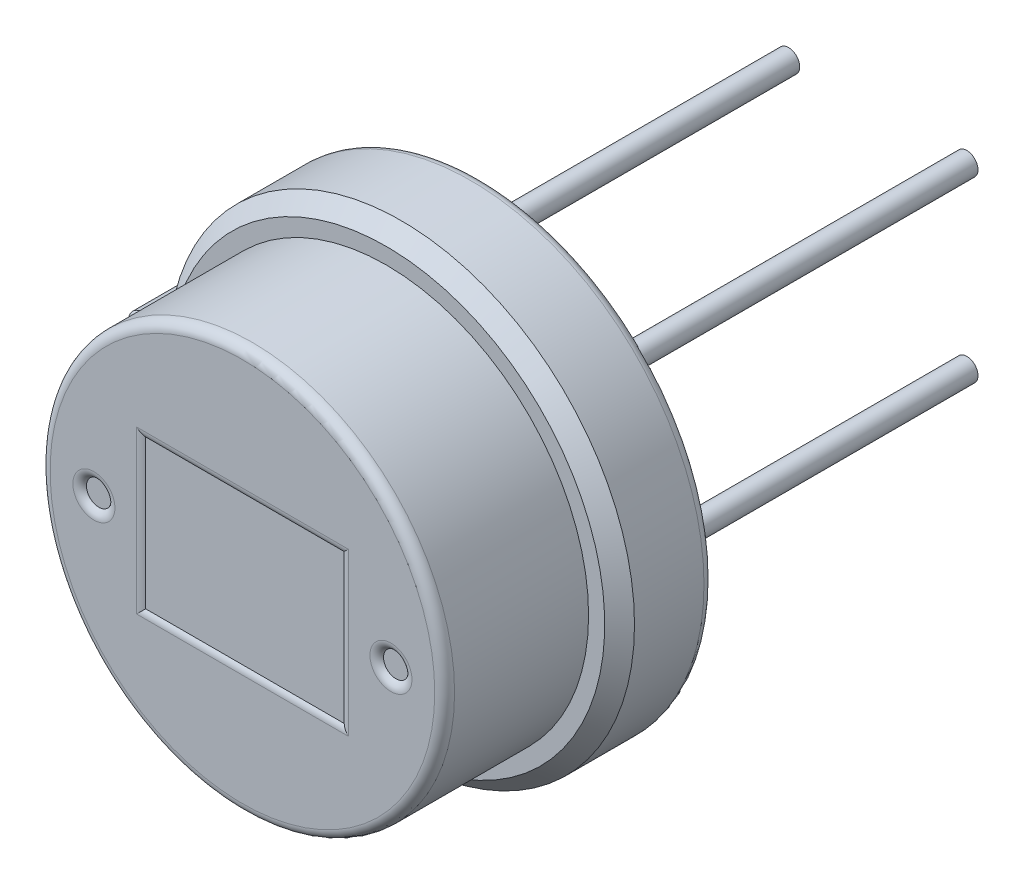
ISO-10303-21;
HEADER;
FILE_DESCRIPTION(('STEP AP214'),'2;1');
FILE_NAME('part.step','',(''),(''),'','','');
FILE_SCHEMA(('AUTOMOTIVE_DESIGN { 1 0 10303 214 1 1 1 1 }'));
ENDSEC;
DATA;
#1=APPLICATION_CONTEXT('core data for automotive mechanical design processes');
#2=APPLICATION_PROTOCOL_DEFINITION('international standard','automotive_design',2000,#1);
#3=PRODUCT_CONTEXT('',#1,'mechanical');
#4=PRODUCT('Part','Part','',(#3));
#5=PRODUCT_RELATED_PRODUCT_CATEGORY('part','',(#4));
#6=PRODUCT_DEFINITION_FORMATION('','',#4);
#7=PRODUCT_DEFINITION_CONTEXT('part definition',#1,'design');
#8=PRODUCT_DEFINITION('design','',#6,#7);
#9=PRODUCT_DEFINITION_SHAPE('','',#8);
#10=(LENGTH_UNIT() NAMED_UNIT(*) SI_UNIT(.MILLI.,.METRE.));
#11=(NAMED_UNIT(*) PLANE_ANGLE_UNIT() SI_UNIT($,.RADIAN.));
#12=(NAMED_UNIT(*) SI_UNIT($,.STERADIAN.) SOLID_ANGLE_UNIT());
#13=UNCERTAINTY_MEASURE_WITH_UNIT(LENGTH_MEASURE(1.E-05),#10,'distance_accuracy_value','');
#14=(GEOMETRIC_REPRESENTATION_CONTEXT(3) GLOBAL_UNCERTAINTY_ASSIGNED_CONTEXT((#13)) GLOBAL_UNIT_ASSIGNED_CONTEXT((#10,
#11,#12)) REPRESENTATION_CONTEXT('',''));
#15=CARTESIAN_POINT('',(0.,0.,0.));
#16=DIRECTION('',(0.,0.,1.));
#17=DIRECTION('',(1.,0.,0.));
#18=AXIS2_PLACEMENT_3D('',#15,#16,#17);
#19=CARTESIAN_POINT('',(-4.93558507170123,-0.800000000000001,1.9));
#20=DIRECTION('',(0.,0.,-1.));
#21=DIRECTION('',(-1.,0.,0.));
#22=AXIS2_PLACEMENT_3D('',#19,#20,#21);
#23=CYLINDRICAL_SURFACE('',#22,0.3);
#24=DIRECTION('',(0.,0.,-1.));
#25=VECTOR('',#24,1.);
#26=CARTESIAN_POINT('',(-4.93558507170123,-0.500000000000002,1.9));
#27=LINE('',#26,#25);
#28=CARTESIAN_POINT('',(-4.93558507170123,-0.500000000000002,1.60000000000001));
#29=VERTEX_POINT('',#28);
#30=CARTESIAN_POINT('',(-4.93558507170123,-0.500000000000002,0.200000000000001));
#31=VERTEX_POINT('',#30);
#32=EDGE_CURVE('E213',#29,#31,#27,.T.);
#33=ORIENTED_EDGE('',*,*,#32,.T.);
#34=CARTESIAN_POINT('',(-4.93558507170123,-0.800000000000001,0.2));
#35=DIRECTION('',(0.,0.,1.));
#36=DIRECTION('',(1.,0.,0.));
#37=AXIS2_PLACEMENT_3D('',#34,#35,#36);
#38=CIRCLE('',#37,0.3);
#39=CARTESIAN_POINT('',(-4.63944996739915,-0.752000000000001,0.200000000000001));
#40=VERTEX_POINT('',#39);
#41=EDGE_CURVE('E309',#31,#40,#38,.F.);
#42=ORIENTED_EDGE('',*,*,#41,.T.);
#43=DIRECTION('',(0.,0.,-1.));
#44=VECTOR('',#43,1.);
#45=CARTESIAN_POINT('',(-4.63944996739915,-0.752000000000001,1.9));
#46=LINE('',#45,#44);
#47=CARTESIAN_POINT('',(-4.63944996739915,-0.752000000000001,1.60000000000001));
#48=VERTEX_POINT('',#47);
#49=EDGE_CURVE('E219',#48,#40,#46,.T.);
#50=ORIENTED_EDGE('',*,*,#49,.F.);
#51=CARTESIAN_POINT('',(-4.93558507170123,-0.800000000000001,1.60000000000001));
#52=DIRECTION('',(0.,0.,1.));
#53=DIRECTION('',(1.,0.,0.));
#54=AXIS2_PLACEMENT_3D('',#51,#52,#53);
#55=CIRCLE('',#54,0.3);
#56=EDGE_CURVE('E300',#48,#29,#55,.T.);
#57=ORIENTED_EDGE('',*,*,#56,.T.);
#58=EDGE_LOOP('',(#33,#42,#50,#57));
#59=FACE_BOUND('',#58,.T.);
#60=ADVANCED_FACE('F44',(#59),#23,.F.);
#61=CARTESIAN_POINT('',(0.,0.,1.9));
#62=DIRECTION('',(0.,0.,-1.));
#63=DIRECTION('',(-1.,0.,0.));
#64=AXIS2_PLACEMENT_3D('',#61,#62,#63);
#65=CYLINDRICAL_SURFACE('',#64,4.7);
#66=ORIENTED_EDGE('',*,*,#49,.T.);
#67=CARTESIAN_POINT('',(0.,0.,0.2));
#68=DIRECTION('',(0.,0.,1.));
#69=DIRECTION('',(1.,0.,0.));
#70=AXIS2_PLACEMENT_3D('',#67,#68,#69);
#71=CIRCLE('',#70,4.7);
#72=CARTESIAN_POINT('',(-4.63944996739915,0.751999999999998,0.200000000000001));
#73=VERTEX_POINT('',#72);
#74=EDGE_CURVE('E11',#40,#73,#71,.T.);
#75=ORIENTED_EDGE('',*,*,#74,.T.);
#76=DIRECTION('',(0.,0.,-1.));
#77=VECTOR('',#76,1.);
#78=CARTESIAN_POINT('',(-4.63944996739915,0.751999999999998,1.9));
#79=LINE('',#78,#77);
#80=CARTESIAN_POINT('',(-4.63944996739915,0.751999999999998,1.60000000000001));
#81=VERTEX_POINT('',#80);
#82=EDGE_CURVE('E243',#81,#73,#79,.T.);
#83=ORIENTED_EDGE('',*,*,#82,.F.);
#84=CARTESIAN_POINT('',(0.,0.,1.60000000000001));
#85=DIRECTION('',(0.,0.,1.));
#86=DIRECTION('',(1.,0.,0.));
#87=AXIS2_PLACEMENT_3D('',#84,#85,#86);
#88=CIRCLE('',#87,4.7);
#89=EDGE_CURVE('E306',#81,#48,#88,.F.);
#90=ORIENTED_EDGE('',*,*,#89,.T.);
#91=EDGE_LOOP('',(#66,#75,#83,#90));
#92=FACE_BOUND('',#91,.T.);
#93=ADVANCED_FACE('F457',(#92),#65,.T.);
#94=CARTESIAN_POINT('',(-4.93558507170123,0.799999999999999,1.9));
#95=DIRECTION('',(0.,0.,-1.));
#96=DIRECTION('',(-1.,0.,0.));
#97=AXIS2_PLACEMENT_3D('',#94,#95,#96);
#98=CYLINDRICAL_SURFACE('',#97,0.3);
#99=ORIENTED_EDGE('',*,*,#82,.T.);
#100=CARTESIAN_POINT('',(-4.93558507170123,0.799999999999999,0.2));
#101=DIRECTION('',(0.,0.,1.));
#102=DIRECTION('',(1.,0.,0.));
#103=AXIS2_PLACEMENT_3D('',#100,#101,#102);
#104=CIRCLE('',#103,0.3);
#105=CARTESIAN_POINT('',(-4.93558507170123,0.499999999999999,0.200000000000001));
#106=VERTEX_POINT('',#105);
#107=EDGE_CURVE('E383',#73,#106,#104,.F.);
#108=ORIENTED_EDGE('',*,*,#107,.T.);
#109=DIRECTION('',(0.,0.,-1.));
#110=VECTOR('',#109,1.);
#111=CARTESIAN_POINT('',(-4.93558507170123,0.499999999999999,1.9));
#112=LINE('',#111,#110);
#113=CARTESIAN_POINT('',(-4.93558507170123,0.499999999999999,1.60000000000001));
#114=VERTEX_POINT('',#113);
#115=EDGE_CURVE('E239',#114,#106,#112,.T.);
#116=ORIENTED_EDGE('',*,*,#115,.F.);
#117=CARTESIAN_POINT('',(-4.93558507170123,0.799999999999999,1.60000000000001));
#118=DIRECTION('',(0.,0.,1.));
#119=DIRECTION('',(1.,0.,0.));
#120=AXIS2_PLACEMENT_3D('',#117,#118,#119);
#121=CIRCLE('',#120,0.3);
#122=EDGE_CURVE('E303',#114,#81,#121,.T.);
#123=ORIENTED_EDGE('',*,*,#122,.T.);
#124=EDGE_LOOP('',(#99,#108,#116,#123));
#125=FACE_BOUND('',#124,.T.);
#126=ADVANCED_FACE('F463',(#125),#98,.F.);
#127=CARTESIAN_POINT('',(-5.2,0.499999999999999,1.9));
#128=DIRECTION('',(0.,-1.,0.));
#129=DIRECTION('',(1.,0.,0.));
#130=AXIS2_PLACEMENT_3D('',#127,#128,#129);
#131=PLANE('',#130);
#132=ORIENTED_EDGE('',*,*,#115,.T.);
#133=DIRECTION('',(-1.,0.,0.));
#134=VECTOR('',#133,1.);
#135=CARTESIAN_POINT('',(-5.2,0.499999999999999,0.2));
#136=LINE('',#135,#134);
#137=CARTESIAN_POINT('',(-5.2,0.499999999999999,0.200000000000001));
#138=VERTEX_POINT('',#137);
#139=EDGE_CURVE('E380',#106,#138,#136,.T.);
#140=ORIENTED_EDGE('',*,*,#139,.T.);
#141=DIRECTION('',(0.,0.,-1.));
#142=VECTOR('',#141,1.);
#143=CARTESIAN_POINT('',(-5.2,0.499999999999999,1.9));
#144=LINE('',#143,#142);
#145=CARTESIAN_POINT('',(-5.2,0.499999999999999,1.60000000000001));
#146=VERTEX_POINT('',#145);
#147=EDGE_CURVE('E235',#146,#138,#144,.T.);
#148=ORIENTED_EDGE('',*,*,#147,.F.);
#149=DIRECTION('',(1.,0.,0.));
#150=VECTOR('',#149,1.);
#151=CARTESIAN_POINT('',(-4.93558507170123,0.499999999999999,1.60000000000001));
#152=LINE('',#151,#150);
#153=EDGE_CURVE('E297',#146,#114,#152,.T.);
#154=ORIENTED_EDGE('',*,*,#153,.T.);
#155=EDGE_LOOP('',(#132,#140,#148,#154));
#156=FACE_BOUND('',#155,.T.);
#157=ADVANCED_FACE('F644',(#156),#131,.F.);
#158=CARTESIAN_POINT('',(-5.2,0.199999999999999,1.9));
#159=DIRECTION('',(0.,0.,-1.));
#160=DIRECTION('',(-1.,0.,0.));
#161=AXIS2_PLACEMENT_3D('',#158,#159,#160);
#162=CYLINDRICAL_SURFACE('',#161,0.3);
#163=ORIENTED_EDGE('',*,*,#147,.T.);
#164=CARTESIAN_POINT('',(-5.2,0.199999999999999,0.199999999999999));
#165=DIRECTION('',(0.,0.,1.));
#166=DIRECTION('',(1.,0.,0.));
#167=AXIS2_PLACEMENT_3D('',#164,#165,#166);
#168=CIRCLE('',#167,0.3);
#169=CARTESIAN_POINT('',(-5.5,0.199999999999997,0.2));
#170=VERTEX_POINT('',#169);
#171=EDGE_CURVE('E377',#138,#170,#168,.T.);
#172=ORIENTED_EDGE('',*,*,#171,.T.);
#173=DIRECTION('',(0.,0.,-1.));
#174=VECTOR('',#173,1.);
#175=CARTESIAN_POINT('',(-5.5,0.199999999999997,1.9));
#176=LINE('',#175,#174);
#177=CARTESIAN_POINT('',(-5.5,0.199999999999997,1.60000000000001));
#178=VERTEX_POINT('',#177);
#179=EDGE_CURVE('E231',#178,#170,#176,.T.);
#180=ORIENTED_EDGE('',*,*,#179,.F.);
#181=CARTESIAN_POINT('',(-5.2,0.199999999999999,1.60000000000001));
#182=DIRECTION('',(0.,0.,1.));
#183=DIRECTION('',(1.,0.,0.));
#184=AXIS2_PLACEMENT_3D('',#181,#182,#183);
#185=CIRCLE('',#184,0.3);
#186=EDGE_CURVE('E291',#178,#146,#185,.F.);
#187=ORIENTED_EDGE('',*,*,#186,.T.);
#188=EDGE_LOOP('',(#163,#172,#180,#187));
#189=FACE_BOUND('',#188,.T.);
#190=ADVANCED_FACE('F640',(#189),#162,.T.);
#191=CARTESIAN_POINT('',(-5.5,0.199999999999997,1.9));
#192=DIRECTION('',(1.,0.,0.));
#193=DIRECTION('',(0.,0.,-1.));
#194=AXIS2_PLACEMENT_3D('',#191,#192,#193);
#195=PLANE('',#194);
#196=ORIENTED_EDGE('',*,*,#179,.T.);
#197=DIRECTION('',(0.,-1.,0.));
#198=VECTOR('',#197,1.);
#199=CARTESIAN_POINT('',(-5.5,0.199999999999997,0.2));
#200=LINE('',#199,#198);
#201=CARTESIAN_POINT('',(-5.5,-0.199999999999999,0.200000000000001));
#202=VERTEX_POINT('',#201);
#203=EDGE_CURVE('E374',#170,#202,#200,.T.);
#204=ORIENTED_EDGE('',*,*,#203,.T.);
#205=DIRECTION('',(0.,0.,-1.));
#206=VECTOR('',#205,1.);
#207=CARTESIAN_POINT('',(-5.5,-0.199999999999999,1.9));
#208=LINE('',#207,#206);
#209=CARTESIAN_POINT('',(-5.5,-0.199999999999999,1.60000000000001));
#210=VERTEX_POINT('',#209);
#211=EDGE_CURVE('E227',#210,#202,#208,.T.);
#212=ORIENTED_EDGE('',*,*,#211,.F.);
#213=DIRECTION('',(0.,1.,0.));
#214=VECTOR('',#213,1.);
#215=CARTESIAN_POINT('',(-5.5,0.199999999999997,1.60000000000001));
#216=LINE('',#215,#214);
#217=EDGE_CURVE('E284',#210,#178,#216,.T.);
#218=ORIENTED_EDGE('',*,*,#217,.T.);
#219=EDGE_LOOP('',(#196,#204,#212,#218));
#220=FACE_BOUND('',#219,.T.);
#221=ADVANCED_FACE('F636',(#220),#195,.F.);
#222=CARTESIAN_POINT('',(-5.2,-0.200000000000002,1.9));
#223=DIRECTION('',(0.,0.,-1.));
#224=DIRECTION('',(-1.,0.,0.));
#225=AXIS2_PLACEMENT_3D('',#222,#223,#224);
#226=CYLINDRICAL_SURFACE('',#225,0.3);
#227=ORIENTED_EDGE('',*,*,#211,.T.);
#228=CARTESIAN_POINT('',(-5.2,-0.200000000000002,0.199999999999999));
#229=DIRECTION('',(0.,0.,1.));
#230=DIRECTION('',(1.,0.,0.));
#231=AXIS2_PLACEMENT_3D('',#228,#229,#230);
#232=CIRCLE('',#231,0.3);
#233=CARTESIAN_POINT('',(-5.2,-0.500000000000001,0.2));
#234=VERTEX_POINT('',#233);
#235=EDGE_CURVE('E371',#202,#234,#232,.T.);
#236=ORIENTED_EDGE('',*,*,#235,.T.);
#237=DIRECTION('',(0.,0.,-1.));
#238=VECTOR('',#237,1.);
#239=CARTESIAN_POINT('',(-5.2,-0.500000000000001,1.9));
#240=LINE('',#239,#238);
#241=CARTESIAN_POINT('',(-5.2,-0.500000000000001,1.60000000000001));
#242=VERTEX_POINT('',#241);
#243=EDGE_CURVE('E223',#242,#234,#240,.T.);
#244=ORIENTED_EDGE('',*,*,#243,.F.);
#245=CARTESIAN_POINT('',(-5.2,-0.200000000000002,1.60000000000001));
#246=DIRECTION('',(0.,0.,1.));
#247=DIRECTION('',(1.,0.,0.));
#248=AXIS2_PLACEMENT_3D('',#245,#246,#247);
#249=CIRCLE('',#248,0.3);
#250=EDGE_CURVE('E288',#242,#210,#249,.F.);
#251=ORIENTED_EDGE('',*,*,#250,.T.);
#252=EDGE_LOOP('',(#227,#236,#244,#251));
#253=FACE_BOUND('',#252,.T.);
#254=ADVANCED_FACE('F632',(#253),#226,.T.);
#255=CARTESIAN_POINT('',(-5.2,-0.500000000000001,1.9));
#256=DIRECTION('',(0.,1.,0.));
#257=DIRECTION('',(-1.,0.,0.));
#258=AXIS2_PLACEMENT_3D('',#255,#256,#257);
#259=PLANE('',#258);
#260=ORIENTED_EDGE('',*,*,#243,.T.);
#261=DIRECTION('',(1.,0.,0.));
#262=VECTOR('',#261,1.);
#263=CARTESIAN_POINT('',(-5.2,-0.500000000000001,0.2));
#264=LINE('',#263,#262);
#265=EDGE_CURVE('E368',#234,#31,#264,.T.);
#266=ORIENTED_EDGE('',*,*,#265,.T.);
#267=ORIENTED_EDGE('',*,*,#32,.F.);
#268=DIRECTION('',(-1.,0.,0.));
#269=VECTOR('',#268,1.);
#270=CARTESIAN_POINT('',(-5.2,-0.500000000000001,1.60000000000001));
#271=LINE('',#270,#269);
#272=EDGE_CURVE('E294',#29,#242,#271,.T.);
#273=ORIENTED_EDGE('',*,*,#272,.T.);
#274=EDGE_LOOP('',(#260,#266,#267,#273));
#275=FACE_BOUND('',#274,.T.);
#276=ADVANCED_FACE('F627',(#275),#259,.F.);
#277=CARTESIAN_POINT('',(-4.93558507170123,-0.800000000000001,1.9));
#278=DIRECTION('',(0.,0.,1.));
#279=DIRECTION('',(1.,0.,0.));
#280=AXIS2_PLACEMENT_3D('',#277,#278,#279);
#281=PLANE('',#280);
#282=DIRECTION('',(-1.,0.,0.));
#283=VECTOR('',#282,1.);
#284=CARTESIAN_POINT('',(-5.2,0.200000000000007,1.9));
#285=LINE('',#284,#283);
#286=CARTESIAN_POINT('',(-4.93558507170123,0.200000000000007,1.9));
#287=VERTEX_POINT('',#286);
#288=CARTESIAN_POINT('',(-5.2,0.200000000000007,1.9));
#289=VERTEX_POINT('',#288);
#290=EDGE_CURVE('E274',#287,#289,#285,.T.);
#291=ORIENTED_EDGE('',*,*,#290,.T.);
#292=DIRECTION('',(0.,-1.,0.));
#293=VECTOR('',#292,1.);
#294=CARTESIAN_POINT('',(-5.20000000000001,-0.199999999999999,1.9));
#295=LINE('',#294,#293);
#296=CARTESIAN_POINT('',(-5.2,-0.200000000000009,1.9));
#297=VERTEX_POINT('',#296);
#298=EDGE_CURVE('E280',#289,#297,#295,.T.);
#299=ORIENTED_EDGE('',*,*,#298,.T.);
#300=DIRECTION('',(1.,0.,0.));
#301=VECTOR('',#300,1.);
#302=CARTESIAN_POINT('',(-4.93558507170123,-0.20000000000001,1.9));
#303=LINE('',#302,#301);
#304=CARTESIAN_POINT('',(-4.93558507170123,-0.20000000000001,1.9));
#305=VERTEX_POINT('',#304);
#306=EDGE_CURVE('E277',#297,#305,#303,.T.);
#307=ORIENTED_EDGE('',*,*,#306,.T.);
#308=CARTESIAN_POINT('',(-4.93558507170123,-0.800000000000001,1.9));
#309=DIRECTION('',(0.,0.,1.));
#310=DIRECTION('',(1.,0.,0.));
#311=AXIS2_PLACEMENT_3D('',#308,#309,#310);
#312=CIRCLE('',#311,0.599999999999992);
#313=CARTESIAN_POINT('',(-4.34331486309709,-0.704000000000002,1.9));
#314=VERTEX_POINT('',#313);
#315=EDGE_CURVE('E271',#305,#314,#312,.F.);
#316=ORIENTED_EDGE('',*,*,#315,.T.);
#317=CARTESIAN_POINT('',(0.,0.,1.9));
#318=DIRECTION('',(0.,0.,1.));
#319=DIRECTION('',(1.,0.,0.));
#320=AXIS2_PLACEMENT_3D('',#317,#318,#319);
#321=CIRCLE('',#320,4.40000000000001);
#322=CARTESIAN_POINT('',(-4.34331486309709,0.703999999999999,1.9));
#323=VERTEX_POINT('',#322);
#324=EDGE_CURVE('E265',#314,#323,#321,.T.);
#325=ORIENTED_EDGE('',*,*,#324,.T.);
#326=CARTESIAN_POINT('',(-4.93558507170123,0.799999999999999,1.9));
#327=DIRECTION('',(0.,0.,1.));
#328=DIRECTION('',(1.,0.,0.));
#329=AXIS2_PLACEMENT_3D('',#326,#327,#328);
#330=CIRCLE('',#329,0.599999999999992);
#331=EDGE_CURVE('E268',#323,#287,#330,.F.);
#332=ORIENTED_EDGE('',*,*,#331,.T.);
#333=EDGE_LOOP('',(#291,#299,#307,#316,#325,#332));
#334=FACE_BOUND('',#333,.T.);
#335=CARTESIAN_POINT('',(0.,0.,1.9));
#336=DIRECTION('',(0.,0.,1.));
#337=DIRECTION('',(1.,0.,0.));
#338=AXIS2_PLACEMENT_3D('',#335,#336,#337);
#339=CIRCLE('',#338,4.075);
#340=CARTESIAN_POINT('',(4.075,0.,1.9));
#341=VERTEX_POINT('',#340);
#342=EDGE_CURVE('E214',#341,#341,#339,.T.);
#343=ORIENTED_EDGE('',*,*,#342,.F.);
#344=EDGE_LOOP('',(#343));
#345=FACE_BOUND('',#344,.T.);
#346=ADVANCED_FACE('F591',(#334,#345),#281,.T.);
#347=CARTESIAN_POINT('',(-4.93558507170123,-0.800000000000001,0.));
#348=DIRECTION('',(0.,0.,1.));
#349=DIRECTION('',(1.,0.,0.));
#350=AXIS2_PLACEMENT_3D('',#347,#348,#349);
#351=PLANE('',#350);
#352=CARTESIAN_POINT('',(0.,0.,0.));
#353=DIRECTION('',(0.,0.,1.));
#354=DIRECTION('',(1.,0.,0.));
#355=AXIS2_PLACEMENT_3D('',#352,#353,#354);
#356=CIRCLE('',#355,4.5);
#357=CARTESIAN_POINT('',(-4.4420265645311,0.719999999999998,0.));
#358=VERTEX_POINT('',#357);
#359=CARTESIAN_POINT('',(-4.4420265645311,-0.720000000000001,0.));
#360=VERTEX_POINT('',#359);
#361=EDGE_CURVE('E344',#358,#360,#356,.F.);
#362=ORIENTED_EDGE('',*,*,#361,.T.);
#363=CARTESIAN_POINT('',(-4.93558507170123,-0.800000000000001,0.));
#364=DIRECTION('',(0.,0.,1.));
#365=DIRECTION('',(1.,0.,0.));
#366=AXIS2_PLACEMENT_3D('',#363,#364,#365);
#367=CIRCLE('',#366,0.5);
#368=CARTESIAN_POINT('',(-4.93558507170123,-0.300000000000002,0.));
#369=VERTEX_POINT('',#368);
#370=EDGE_CURVE('E364',#360,#369,#367,.T.);
#371=ORIENTED_EDGE('',*,*,#370,.T.);
#372=DIRECTION('',(1.,0.,0.));
#373=VECTOR('',#372,1.);
#374=CARTESIAN_POINT('',(-4.93558507170123,-0.300000000000002,0.));
#375=LINE('',#374,#373);
#376=CARTESIAN_POINT('',(-5.2,-0.300000000000001,0.));
#377=VERTEX_POINT('',#376);
#378=EDGE_CURVE('E361',#369,#377,#375,.F.);
#379=ORIENTED_EDGE('',*,*,#378,.T.);
#380=CARTESIAN_POINT('',(-5.2,-0.200000000000002,0.));
#381=DIRECTION('',(0.,0.,1.));
#382=DIRECTION('',(1.,0.,0.));
#383=AXIS2_PLACEMENT_3D('',#380,#381,#382);
#384=CIRCLE('',#383,0.0999999999999999);
#385=CARTESIAN_POINT('',(-5.3,-0.200000000000001,0.));
#386=VERTEX_POINT('',#385);
#387=EDGE_CURVE('E359',#377,#386,#384,.F.);
#388=ORIENTED_EDGE('',*,*,#387,.T.);
#389=DIRECTION('',(0.,-1.,0.));
#390=VECTOR('',#389,1.);
#391=CARTESIAN_POINT('',(-5.3,-0.800000000000001,0.));
#392=LINE('',#391,#390);
#393=CARTESIAN_POINT('',(-5.3,0.199999999999997,0.));
#394=VERTEX_POINT('',#393);
#395=EDGE_CURVE('E356',#386,#394,#392,.F.);
#396=ORIENTED_EDGE('',*,*,#395,.T.);
#397=CARTESIAN_POINT('',(-5.2,0.199999999999999,0.));
#398=DIRECTION('',(0.,0.,1.));
#399=DIRECTION('',(1.,0.,0.));
#400=AXIS2_PLACEMENT_3D('',#397,#398,#399);
#401=CIRCLE('',#400,0.0999999999999999);
#402=CARTESIAN_POINT('',(-5.2,0.299999999999999,0.));
#403=VERTEX_POINT('',#402);
#404=EDGE_CURVE('E353',#394,#403,#401,.F.);
#405=ORIENTED_EDGE('',*,*,#404,.T.);
#406=DIRECTION('',(-1.,0.,0.));
#407=VECTOR('',#406,1.);
#408=CARTESIAN_POINT('',(-4.93558507170123,0.299999999999999,0.));
#409=LINE('',#408,#407);
#410=CARTESIAN_POINT('',(-4.93558507170123,0.299999999999999,0.));
#411=VERTEX_POINT('',#410);
#412=EDGE_CURVE('E350',#403,#411,#409,.F.);
#413=ORIENTED_EDGE('',*,*,#412,.T.);
#414=CARTESIAN_POINT('',(-4.93558507170123,0.799999999999999,0.));
#415=DIRECTION('',(0.,0.,1.));
#416=DIRECTION('',(1.,0.,0.));
#417=AXIS2_PLACEMENT_3D('',#414,#415,#416);
#418=CIRCLE('',#417,0.5);
#419=EDGE_CURVE('E347',#411,#358,#418,.T.);
#420=ORIENTED_EDGE('',*,*,#419,.T.);
#421=EDGE_LOOP('',(#362,#371,#379,#388,#396,#405,#413,#420));
#422=FACE_BOUND('',#421,.T.);
#423=CARTESIAN_POINT('',(-1.7960512242138,1.79605122421386,0.));
#424=DIRECTION('',(0.,0.,1.));
#425=DIRECTION('',(1.,0.,0.));
#426=AXIS2_PLACEMENT_3D('',#423,#424,#425);
#427=CIRCLE('',#426,0.225);
#428=CARTESIAN_POINT('',(-1.5710512242138,1.79605122421386,0.));
#429=VERTEX_POINT('',#428);
#430=EDGE_CURVE('E261',#429,#429,#427,.F.);
#431=ORIENTED_EDGE('',*,*,#430,.F.);
#432=EDGE_LOOP('',(#431));
#433=FACE_BOUND('',#432,.T.);
#434=CARTESIAN_POINT('',(1.79605122421384,1.79605122421382,0.));
#435=DIRECTION('',(0.,0.,1.));
#436=DIRECTION('',(1.,0.,0.));
#437=AXIS2_PLACEMENT_3D('',#434,#435,#436);
#438=CIRCLE('',#437,0.225000000000001);
#439=CARTESIAN_POINT('',(2.02105122421384,1.79605122421382,0.));
#440=VERTEX_POINT('',#439);
#441=EDGE_CURVE('E257',#440,#440,#438,.F.);
#442=ORIENTED_EDGE('',*,*,#441,.F.);
#443=EDGE_LOOP('',(#442));
#444=FACE_BOUND('',#443,.T.);
#445=CARTESIAN_POINT('',(-1.79605122421384,-1.79605122421382,0.));
#446=DIRECTION('',(0.,0.,1.));
#447=DIRECTION('',(1.,0.,0.));
#448=AXIS2_PLACEMENT_3D('',#445,#446,#447);
#449=CIRCLE('',#448,0.225);
#450=CARTESIAN_POINT('',(-1.57105122421384,-1.79605122421382,0.));
#451=VERTEX_POINT('',#450);
#452=EDGE_CURVE('E253',#451,#451,#449,.F.);
#453=ORIENTED_EDGE('',*,*,#452,.F.);
#454=EDGE_LOOP('',(#453));
#455=FACE_BOUND('',#454,.T.);
#456=CARTESIAN_POINT('',(1.79605122421384,-1.79605122421382,0.));
#457=DIRECTION('',(0.,0.,1.));
#458=DIRECTION('',(1.,0.,0.));
#459=AXIS2_PLACEMENT_3D('',#456,#457,#458);
#460=CIRCLE('',#459,0.225);
#461=CARTESIAN_POINT('',(2.02105122421384,-1.79605122421382,0.));
#462=VERTEX_POINT('',#461);
#463=EDGE_CURVE('E218',#462,#462,#460,.F.);
#464=ORIENTED_EDGE('',*,*,#463,.F.);
#465=EDGE_LOOP('',(#464));
#466=FACE_BOUND('',#465,.T.);
#467=ADVANCED_FACE('F588',(#422,#433,#444,#455,#466),#351,.F.);
#468=CARTESIAN_POINT('',(0.,0.,4.8));
#469=DIRECTION('',(0.,0.,-1.));
#470=DIRECTION('',(-1.,0.,0.));
#471=AXIS2_PLACEMENT_3D('',#468,#469,#470);
#472=CYLINDRICAL_SURFACE('',#471,4.075);
#473=CARTESIAN_POINT('',(0.,0.,4.6));
#474=DIRECTION('',(0.,0.,1.));
#475=DIRECTION('',(1.,0.,0.));
#476=AXIS2_PLACEMENT_3D('',#473,#474,#475);
#477=CIRCLE('',#476,4.075);
#478=CARTESIAN_POINT('',(4.075,0.,4.6));
#479=VERTEX_POINT('',#478);
#480=EDGE_CURVE('E54',#479,#479,#477,.F.);
#481=ORIENTED_EDGE('',*,*,#480,.T.);
#482=EDGE_LOOP('',(#481));
#483=FACE_BOUND('',#482,.T.);
#484=ORIENTED_EDGE('',*,*,#342,.T.);
#485=EDGE_LOOP('',(#484));
#486=FACE_BOUND('',#485,.T.);
#487=ADVANCED_FACE('F546',(#483,#486),#472,.T.);
#488=CARTESIAN_POINT('',(0.,0.,4.8));
#489=DIRECTION('',(0.,0.,1.));
#490=DIRECTION('',(1.,0.,0.));
#491=AXIS2_PLACEMENT_3D('',#488,#489,#490);
#492=PLANE('',#491);
#493=CARTESIAN_POINT('',(0.,0.,4.8));
#494=DIRECTION('',(0.,0.,1.));
#495=DIRECTION('',(1.,0.,0.));
#496=AXIS2_PLACEMENT_3D('',#493,#494,#495);
#497=CIRCLE('',#496,3.875);
#498=CARTESIAN_POINT('',(3.875,0.,4.8));
#499=VERTEX_POINT('',#498);
#500=EDGE_CURVE('E403',#499,#499,#497,.T.);
#501=ORIENTED_EDGE('',*,*,#500,.T.);
#502=EDGE_LOOP('',(#501));
#503=FACE_BOUND('',#502,.T.);
#504=DIRECTION('',(0.,-1.,0.));
#505=VECTOR('',#504,1.);
#506=CARTESIAN_POINT('',(-2.13228756555323,1.5,4.8));
#507=LINE('',#506,#505);
#508=CARTESIAN_POINT('',(-2.13228756555323,-1.63228756555323,4.8));
#509=VERTEX_POINT('',#508);
#510=CARTESIAN_POINT('',(-2.13228756555323,1.63228756555323,4.8));
#511=VERTEX_POINT('',#510);
#512=EDGE_CURVE('E62',#509,#511,#507,.F.);
#513=ORIENTED_EDGE('',*,*,#512,.T.);
#514=DIRECTION('',(-1.,0.,0.));
#515=VECTOR('',#514,1.);
#516=CARTESIAN_POINT('',(2.,1.63228756555323,4.8));
#517=LINE('',#516,#515);
#518=CARTESIAN_POINT('',(2.13228756555323,1.63228756555323,4.8));
#519=VERTEX_POINT('',#518);
#520=EDGE_CURVE('E400',#511,#519,#517,.F.);
#521=ORIENTED_EDGE('',*,*,#520,.T.);
#522=DIRECTION('',(0.,1.,0.));
#523=VECTOR('',#522,1.);
#524=CARTESIAN_POINT('',(2.13228756555323,-1.5,4.8));
#525=LINE('',#524,#523);
#526=CARTESIAN_POINT('',(2.13228756555323,-1.63228756555323,4.8));
#527=VERTEX_POINT('',#526);
#528=EDGE_CURVE('E193',#519,#527,#525,.F.);
#529=ORIENTED_EDGE('',*,*,#528,.T.);
#530=DIRECTION('',(1.,0.,0.));
#531=VECTOR('',#530,1.);
#532=CARTESIAN_POINT('',(-2.,-1.63228756555323,4.8));
#533=LINE('',#532,#531);
#534=EDGE_CURVE('E67',#527,#509,#533,.F.);
#535=ORIENTED_EDGE('',*,*,#534,.T.);
#536=EDGE_LOOP('',(#513,#521,#529,#535));
#537=FACE_BOUND('',#536,.T.);
#538=CARTESIAN_POINT('',(2.99263538753936,0.,4.8));
#539=DIRECTION('',(0.,0.,1.));
#540=DIRECTION('',(1.,0.,0.));
#541=AXIS2_PLACEMENT_3D('',#538,#539,#540);
#542=CIRCLE('',#541,0.423205080756889);
#543=CARTESIAN_POINT('',(3.41584046829624,0.,4.8));
#544=VERTEX_POINT('',#543);
#545=EDGE_CURVE('E390',#544,#544,#542,.F.);
#546=ORIENTED_EDGE('',*,*,#545,.T.);
#547=EDGE_LOOP('',(#546));
#548=FACE_BOUND('',#547,.T.);
#549=CARTESIAN_POINT('',(-2.99263538753936,0.,4.8));
#550=DIRECTION('',(0.,0.,1.));
#551=DIRECTION('',(1.,0.,0.));
#552=AXIS2_PLACEMENT_3D('',#549,#550,#551);
#553=CIRCLE('',#552,0.423205080756889);
#554=CARTESIAN_POINT('',(-2.56943030678247,0.,4.8));
#555=VERTEX_POINT('',#554);
#556=EDGE_CURVE('E386',#555,#555,#553,.F.);
#557=ORIENTED_EDGE('',*,*,#556,.T.);
#558=EDGE_LOOP('',(#557));
#559=FACE_BOUND('',#558,.T.);
#560=ADVANCED_FACE('F544',(#503,#537,#548,#559),#492,.T.);
#561=CARTESIAN_POINT('',(0.,0.,4.75));
#562=DIRECTION('',(0.,0.,1.));
#563=DIRECTION('',(1.,0.,0.));
#564=AXIS2_PLACEMENT_3D('',#561,#562,#563);
#565=PLANE('',#564);
#566=DIRECTION('',(0.,1.,0.));
#567=VECTOR('',#566,1.);
#568=CARTESIAN_POINT('',(2.,1.5,4.75));
#569=LINE('',#568,#567);
#570=CARTESIAN_POINT('',(2.,-1.5,4.75));
#571=VERTEX_POINT('',#570);
#572=CARTESIAN_POINT('',(2.,1.5,4.75));
#573=VERTEX_POINT('',#572);
#574=EDGE_CURVE('E177',#571,#573,#569,.T.);
#575=ORIENTED_EDGE('',*,*,#574,.T.);
#576=DIRECTION('',(-1.,0.,0.));
#577=VECTOR('',#576,1.);
#578=CARTESIAN_POINT('',(-2.,1.5,4.75));
#579=LINE('',#578,#577);
#580=CARTESIAN_POINT('',(-2.,1.5,4.75));
#581=VERTEX_POINT('',#580);
#582=EDGE_CURVE('E181',#573,#581,#579,.T.);
#583=ORIENTED_EDGE('',*,*,#582,.T.);
#584=DIRECTION('',(0.,-1.,0.));
#585=VECTOR('',#584,1.);
#586=CARTESIAN_POINT('',(-2.,1.5,4.75));
#587=LINE('',#586,#585);
#588=CARTESIAN_POINT('',(-2.,-1.5,4.75));
#589=VERTEX_POINT('',#588);
#590=EDGE_CURVE('E203',#581,#589,#587,.T.);
#591=ORIENTED_EDGE('',*,*,#590,.T.);
#592=DIRECTION('',(1.,0.,0.));
#593=VECTOR('',#592,1.);
#594=CARTESIAN_POINT('',(-2.,-1.5,4.75));
#595=LINE('',#594,#593);
#596=EDGE_CURVE('E183',#589,#571,#595,.T.);
#597=ORIENTED_EDGE('',*,*,#596,.T.);
#598=EDGE_LOOP('',(#575,#583,#591,#597));
#599=FACE_BOUND('',#598,.T.);
#600=ADVANCED_FACE('F179',(#599),#565,.T.);
#601=CARTESIAN_POINT('',(2.99263538753936,0.,4.7));
#602=DIRECTION('',(0.,0.,-1.));
#603=DIRECTION('',(-1.,0.,0.));
#604=AXIS2_PLACEMENT_3D('',#601,#602,#603);
#605=PLANE('',#604);
#606=CARTESIAN_POINT('',(2.99263538753936,0.,4.7));
#607=DIRECTION('',(0.,0.,1.));
#608=DIRECTION('',(-1.,0.,0.));
#609=AXIS2_PLACEMENT_3D('',#606,#607,#608);
#610=CIRCLE('',#609,0.25);
#611=CARTESIAN_POINT('',(2.74263538753936,0.,4.7));
#612=VERTEX_POINT('',#611);
#613=EDGE_CURVE('E559',#612,#612,#610,.T.);
#614=ORIENTED_EDGE('',*,*,#613,.T.);
#615=EDGE_LOOP('',(#614));
#616=FACE_BOUND('',#615,.T.);
#617=ADVANCED_FACE('F613',(#616),#605,.F.);
#618=CARTESIAN_POINT('',(-2.99263538753936,0.,4.7));
#619=DIRECTION('',(0.,0.,1.));
#620=DIRECTION('',(1.,0.,0.));
#621=AXIS2_PLACEMENT_3D('',#618,#619,#620);
#622=PLANE('',#621);
#623=CARTESIAN_POINT('',(-2.99263538753936,0.,4.7));
#624=DIRECTION('',(0.,0.,1.));
#625=DIRECTION('',(1.,0.,0.));
#626=AXIS2_PLACEMENT_3D('',#623,#624,#625);
#627=CIRCLE('',#626,0.25);
#628=CARTESIAN_POINT('',(-2.74263538753936,0.,4.7));
#629=VERTEX_POINT('',#628);
#630=EDGE_CURVE('E188',#629,#629,#627,.T.);
#631=ORIENTED_EDGE('',*,*,#630,.T.);
#632=EDGE_LOOP('',(#631));
#633=FACE_BOUND('',#632,.T.);
#634=ADVANCED_FACE('F603',(#633),#622,.T.);
#635=CARTESIAN_POINT('',(1.79605122421384,-1.79605122421382,-8.));
#636=DIRECTION('',(0.,0.,1.));
#637=DIRECTION('',(1.,0.,0.));
#638=AXIS2_PLACEMENT_3D('',#635,#636,#637);
#639=CYLINDRICAL_SURFACE('',#638,0.225);
#640=CARTESIAN_POINT('',(1.79605122421384,-1.79605122421382,-8.));
#641=DIRECTION('',(0.,0.,-1.));
#642=DIRECTION('',(-1.,0.,0.));
#643=AXIS2_PLACEMENT_3D('',#640,#641,#642);
#644=CIRCLE('',#643,0.225);
#645=CARTESIAN_POINT('',(1.57105122421384,-1.79605122421382,-8.));
#646=VERTEX_POINT('',#645);
#647=EDGE_CURVE('E563',#646,#646,#644,.T.);
#648=ORIENTED_EDGE('',*,*,#647,.F.);
#649=EDGE_LOOP('',(#648));
#650=FACE_BOUND('',#649,.T.);
#651=ORIENTED_EDGE('',*,*,#463,.T.);
#652=EDGE_LOOP('',(#651));
#653=FACE_BOUND('',#652,.T.);
#654=ADVANCED_FACE('F600',(#650,#653),#639,.T.);
#655=CARTESIAN_POINT('',(1.79605122421384,-1.79605122421382,-8.));
#656=DIRECTION('',(0.,0.,-1.));
#657=DIRECTION('',(-1.,0.,0.));
#658=AXIS2_PLACEMENT_3D('',#655,#656,#657);
#659=PLANE('',#658);
#660=ORIENTED_EDGE('',*,*,#647,.T.);
#661=EDGE_LOOP('',(#660));
#662=FACE_BOUND('',#661,.T.);
#663=ADVANCED_FACE('F602',(#662),#659,.T.);
#664=CARTESIAN_POINT('',(-1.79605122421384,-1.79605122421382,-8.));
#665=DIRECTION('',(0.,0.,1.));
#666=DIRECTION('',(1.,0.,0.));
#667=AXIS2_PLACEMENT_3D('',#664,#665,#666);
#668=CYLINDRICAL_SURFACE('',#667,0.225);
#669=CARTESIAN_POINT('',(-1.79605122421384,-1.79605122421382,-8.));
#670=DIRECTION('',(0.,0.,-1.));
#671=DIRECTION('',(1.,0.,0.));
#672=AXIS2_PLACEMENT_3D('',#669,#670,#671);
#673=CIRCLE('',#672,0.225);
#674=CARTESIAN_POINT('',(-1.57105122421384,-1.79605122421382,-8.));
#675=VERTEX_POINT('',#674);
#676=EDGE_CURVE('E568',#675,#675,#673,.T.);
#677=ORIENTED_EDGE('',*,*,#676,.F.);
#678=EDGE_LOOP('',(#677));
#679=FACE_BOUND('',#678,.T.);
#680=ORIENTED_EDGE('',*,*,#452,.T.);
#681=EDGE_LOOP('',(#680));
#682=FACE_BOUND('',#681,.T.);
#683=ADVANCED_FACE('F610',(#679,#682),#668,.T.);
#684=CARTESIAN_POINT('',(-1.79605122421384,-1.79605122421382,-8.));
#685=DIRECTION('',(0.,0.,1.));
#686=DIRECTION('',(1.,0.,0.));
#687=AXIS2_PLACEMENT_3D('',#684,#685,#686);
#688=PLANE('',#687);
#689=ORIENTED_EDGE('',*,*,#676,.T.);
#690=EDGE_LOOP('',(#689));
#691=FACE_BOUND('',#690,.T.);
#692=ADVANCED_FACE('F762',(#691),#688,.F.);
#693=CARTESIAN_POINT('',(1.79605122421384,1.79605122421382,-8.));
#694=DIRECTION('',(0.,0.,1.));
#695=DIRECTION('',(1.,0.,0.));
#696=AXIS2_PLACEMENT_3D('',#693,#694,#695);
#697=CYLINDRICAL_SURFACE('',#696,0.225000000000001);
#698=CARTESIAN_POINT('',(1.79605122421384,1.79605122421382,-8.));
#699=DIRECTION('',(0.,0.,-1.));
#700=DIRECTION('',(-1.,0.,0.));
#701=AXIS2_PLACEMENT_3D('',#698,#699,#700);
#702=CIRCLE('',#701,0.225000000000001);
#703=CARTESIAN_POINT('',(1.57105122421384,1.79605122421382,-8.));
#704=VERTEX_POINT('',#703);
#705=EDGE_CURVE('E572',#704,#704,#702,.T.);
#706=ORIENTED_EDGE('',*,*,#705,.F.);
#707=EDGE_LOOP('',(#706));
#708=FACE_BOUND('',#707,.T.);
#709=ORIENTED_EDGE('',*,*,#441,.T.);
#710=EDGE_LOOP('',(#709));
#711=FACE_BOUND('',#710,.T.);
#712=ADVANCED_FACE('F770',(#708,#711),#697,.T.);
#713=CARTESIAN_POINT('',(1.79605122421384,1.79605122421382,-8.));
#714=DIRECTION('',(0.,0.,-1.));
#715=DIRECTION('',(-1.,0.,0.));
#716=AXIS2_PLACEMENT_3D('',#713,#714,#715);
#717=PLANE('',#716);
#718=ORIENTED_EDGE('',*,*,#705,.T.);
#719=EDGE_LOOP('',(#718));
#720=FACE_BOUND('',#719,.T.);
#721=ADVANCED_FACE('F584',(#720),#717,.T.);
#722=CARTESIAN_POINT('',(-1.7960512242138,1.79605122421386,-8.));
#723=DIRECTION('',(0.,0.,1.));
#724=DIRECTION('',(1.,0.,0.));
#725=AXIS2_PLACEMENT_3D('',#722,#723,#724);
#726=CYLINDRICAL_SURFACE('',#725,0.225);
#727=CARTESIAN_POINT('',(-1.7960512242138,1.79605122421386,-8.));
#728=DIRECTION('',(0.,0.,-1.));
#729=DIRECTION('',(1.,0.,0.));
#730=AXIS2_PLACEMENT_3D('',#727,#728,#729);
#731=CIRCLE('',#730,0.225);
#732=CARTESIAN_POINT('',(-1.5710512242138,1.79605122421386,-8.));
#733=VERTEX_POINT('',#732);
#734=EDGE_CURVE('E341',#733,#733,#731,.T.);
#735=ORIENTED_EDGE('',*,*,#734,.F.);
#736=EDGE_LOOP('',(#735));
#737=FACE_BOUND('',#736,.T.);
#738=ORIENTED_EDGE('',*,*,#430,.T.);
#739=EDGE_LOOP('',(#738));
#740=FACE_BOUND('',#739,.T.);
#741=ADVANCED_FACE('F581',(#737,#740),#726,.T.);
#742=CARTESIAN_POINT('',(-1.7960512242138,1.79605122421386,-8.));
#743=DIRECTION('',(0.,0.,1.));
#744=DIRECTION('',(1.,0.,0.));
#745=AXIS2_PLACEMENT_3D('',#742,#743,#744);
#746=PLANE('',#745);
#747=ORIENTED_EDGE('',*,*,#734,.T.);
#748=EDGE_LOOP('',(#747));
#749=FACE_BOUND('',#748,.T.);
#750=ADVANCED_FACE('F500',(#749),#746,.F.);
#751=CARTESIAN_POINT('',(0.,0.,1.9));
#752=DIRECTION('',(0.,0.,-1.));
#753=DIRECTION('',(-1.,0.,0.));
#754=AXIS2_PLACEMENT_3D('',#751,#752,#753);
#755=CONICAL_SURFACE('',#754,4.40000000000001,0.785398163397445);
#756=DIRECTION('',(0.697997134664605,0.113137084989848,0.707106781186549));
#757=VECTOR('',#756,1.);
#758=CARTESIAN_POINT('',(-4.63944996739915,-0.752000000000001,1.60000000000001));
#759=LINE('',#758,#757);
#760=EDGE_CURVE('E333',#48,#314,#759,.T.);
#761=ORIENTED_EDGE('',*,*,#760,.F.);
#762=ORIENTED_EDGE('',*,*,#89,.F.);
#763=DIRECTION('',(-0.697997134664603,0.113137084989849,-0.70710678118655));
#764=VECTOR('',#763,1.);
#765=CARTESIAN_POINT('',(-4.34331486309709,0.703999999999999,1.9));
#766=LINE('',#765,#764);
#767=EDGE_CURVE('E337',#323,#81,#766,.T.);
#768=ORIENTED_EDGE('',*,*,#767,.F.);
#769=ORIENTED_EDGE('',*,*,#324,.F.);
#770=EDGE_LOOP('',(#761,#762,#768,#769));
#771=FACE_BOUND('',#770,.T.);
#772=ADVANCED_FACE('F496',(#771),#755,.T.);
#773=CARTESIAN_POINT('',(-4.93558507170123,0.799999999999999,1.9));
#774=DIRECTION('',(0.,0.,1.));
#775=DIRECTION('',(1.,0.,0.));
#776=AXIS2_PLACEMENT_3D('',#773,#774,#775);
#777=CONICAL_SURFACE('',#776,0.599999999999992,0.785398163397445);
#778=ORIENTED_EDGE('',*,*,#767,.T.);
#779=ORIENTED_EDGE('',*,*,#122,.F.);
#780=DIRECTION('',(0.,0.707106781186545,-0.70710678118655));
#781=VECTOR('',#780,1.);
#782=CARTESIAN_POINT('',(-4.93558507170123,0.200000000000007,1.9));
#783=LINE('',#782,#781);
#784=EDGE_CURVE('E329',#287,#114,#783,.T.);
#785=ORIENTED_EDGE('',*,*,#784,.F.);
#786=ORIENTED_EDGE('',*,*,#331,.F.);
#787=EDGE_LOOP('',(#778,#779,#785,#786));
#788=FACE_BOUND('',#787,.T.);
#789=ADVANCED_FACE('F492',(#788),#777,.F.);
#790=CARTESIAN_POINT('',(-4.93558507170123,-0.800000000000001,1.9));
#791=DIRECTION('',(0.,0.,1.));
#792=DIRECTION('',(1.,0.,0.));
#793=AXIS2_PLACEMENT_3D('',#790,#791,#792);
#794=CONICAL_SURFACE('',#793,0.599999999999992,0.785398163397445);
#795=ORIENTED_EDGE('',*,*,#760,.T.);
#796=ORIENTED_EDGE('',*,*,#315,.F.);
#797=DIRECTION('',(0.,0.707106781186545,0.70710678118655));
#798=VECTOR('',#797,1.);
#799=CARTESIAN_POINT('',(-4.93558507170123,-0.500000000000002,1.60000000000001));
#800=LINE('',#799,#798);
#801=EDGE_CURVE('E325',#29,#305,#800,.T.);
#802=ORIENTED_EDGE('',*,*,#801,.F.);
#803=ORIENTED_EDGE('',*,*,#56,.F.);
#804=EDGE_LOOP('',(#795,#796,#802,#803));
#805=FACE_BOUND('',#804,.T.);
#806=ADVANCED_FACE('F488',(#805),#794,.F.);
#807=CARTESIAN_POINT('',(-4.93558507170123,0.200000000000007,1.9));
#808=DIRECTION('',(0.,0.70710678118655,0.707106781186545));
#809=DIRECTION('',(1.,0.,0.));
#810=AXIS2_PLACEMENT_3D('',#807,#808,#809);
#811=PLANE('',#810);
#812=ORIENTED_EDGE('',*,*,#784,.T.);
#813=ORIENTED_EDGE('',*,*,#153,.F.);
#814=DIRECTION('',(0.,0.707106781186545,-0.70710678118655));
#815=VECTOR('',#814,1.);
#816=CARTESIAN_POINT('',(-5.2,0.200000000000007,1.9));
#817=LINE('',#816,#815);
#818=EDGE_CURVE('E321',#289,#146,#817,.T.);
#819=ORIENTED_EDGE('',*,*,#818,.F.);
#820=ORIENTED_EDGE('',*,*,#290,.F.);
#821=EDGE_LOOP('',(#812,#813,#819,#820));
#822=FACE_BOUND('',#821,.T.);
#823=ADVANCED_FACE('F484',(#822),#811,.T.);
#824=CARTESIAN_POINT('',(-4.93558507170123,-0.20000000000001,1.9));
#825=DIRECTION('',(0.,-0.70710678118655,0.707106781186545));
#826=DIRECTION('',(-1.,0.,0.));
#827=AXIS2_PLACEMENT_3D('',#824,#825,#826);
#828=PLANE('',#827);
#829=ORIENTED_EDGE('',*,*,#801,.T.);
#830=ORIENTED_EDGE('',*,*,#306,.F.);
#831=DIRECTION('',(0.,0.707106781186545,0.70710678118655));
#832=VECTOR('',#831,1.);
#833=CARTESIAN_POINT('',(-5.2,-0.500000000000001,1.60000000000001));
#834=LINE('',#833,#832);
#835=EDGE_CURVE('E317',#242,#297,#834,.T.);
#836=ORIENTED_EDGE('',*,*,#835,.F.);
#837=ORIENTED_EDGE('',*,*,#272,.F.);
#838=EDGE_LOOP('',(#829,#830,#836,#837));
#839=FACE_BOUND('',#838,.T.);
#840=ADVANCED_FACE('F480',(#839),#828,.T.);
#841=CARTESIAN_POINT('',(-5.2,0.199999999999999,1.60000000000001));
#842=DIRECTION('',(0.,0.,-1.));
#843=DIRECTION('',(-1.,0.,0.));
#844=AXIS2_PLACEMENT_3D('',#841,#842,#843);
#845=CONICAL_SURFACE('',#844,0.299999999999992,0.785398163397445);
#846=ORIENTED_EDGE('',*,*,#818,.T.);
#847=ORIENTED_EDGE('',*,*,#186,.F.);
#848=DIRECTION('',(-0.707106781186545,0.,-0.70710678118655));
#849=VECTOR('',#848,1.);
#850=CARTESIAN_POINT('',(-5.20000000000001,0.199999999999997,1.9));
#851=LINE('',#850,#849);
#852=EDGE_CURVE('E313',#289,#178,#851,.T.);
#853=ORIENTED_EDGE('',*,*,#852,.F.);
#854=EDGE_LOOP('',(#846,#847,#853));
#855=FACE_BOUND('',#854,.T.);
#856=ADVANCED_FACE('F476',(#855),#845,.T.);
#857=CARTESIAN_POINT('',(-5.2,-0.200000000000002,1.60000000000001));
#858=DIRECTION('',(0.,0.,-1.));
#859=DIRECTION('',(-1.,0.,0.));
#860=AXIS2_PLACEMENT_3D('',#857,#858,#859);
#861=CONICAL_SURFACE('',#860,0.299999999999992,0.785398163397445);
#862=ORIENTED_EDGE('',*,*,#250,.F.);
#863=ORIENTED_EDGE('',*,*,#835,.T.);
#864=DIRECTION('',(0.707106781186545,0.,0.70710678118655));
#865=VECTOR('',#864,1.);
#866=CARTESIAN_POINT('',(-5.5,-0.199999999999999,1.60000000000001));
#867=LINE('',#866,#865);
#868=EDGE_CURVE('E310',#210,#297,#867,.T.);
#869=ORIENTED_EDGE('',*,*,#868,.F.);
#870=EDGE_LOOP('',(#862,#863,#869));
#871=FACE_BOUND('',#870,.T.);
#872=ADVANCED_FACE('F472',(#871),#861,.T.);
#873=CARTESIAN_POINT('',(-5.20000000000001,-0.800000000000001,1.9));
#874=DIRECTION('',(-0.70710678118655,0.,0.707106781186545));
#875=DIRECTION('',(0.,1.,0.));
#876=AXIS2_PLACEMENT_3D('',#873,#874,#875);
#877=PLANE('',#876);
#878=ORIENTED_EDGE('',*,*,#852,.T.);
#879=ORIENTED_EDGE('',*,*,#217,.F.);
#880=ORIENTED_EDGE('',*,*,#868,.T.);
#881=ORIENTED_EDGE('',*,*,#298,.F.);
#882=EDGE_LOOP('',(#878,#879,#880,#881));
#883=FACE_BOUND('',#882,.T.);
#884=ADVANCED_FACE('F468',(#883),#877,.T.);
#885=CARTESIAN_POINT('',(-5.2,0.199999999999999,0.2));
#886=DIRECTION('',(0.,0.,1.));
#887=DIRECTION('',(1.,0.,0.));
#888=AXIS2_PLACEMENT_3D('',#885,#886,#887);
#889=DEGENERATE_TOROIDAL_SURFACE('',#888,0.0999999999999999,0.2,.T.);
#890=CARTESIAN_POINT('',(-5.2,0.299999999999999,0.2));
#891=DIRECTION('',(1.,0.,0.));
#892=DIRECTION('',(0.,1.,0.));
#893=AXIS2_PLACEMENT_3D('',#890,#891,#892);
#894=CIRCLE('',#893,0.2);
#895=EDGE_CURVE('E432',#403,#138,#894,.T.);
#896=ORIENTED_EDGE('',*,*,#895,.F.);
#897=ORIENTED_EDGE('',*,*,#404,.F.);
#898=CARTESIAN_POINT('',(-5.3,0.199999999999998,0.2));
#899=DIRECTION('',(0.,-1.,0.));
#900=DIRECTION('',(0.,0.,-1.));
#901=AXIS2_PLACEMENT_3D('',#898,#899,#900);
#902=CIRCLE('',#901,0.2);
#903=EDGE_CURVE('E314',#170,#394,#902,.T.);
#904=ORIENTED_EDGE('',*,*,#903,.F.);
#905=ORIENTED_EDGE('',*,*,#171,.F.);
#906=EDGE_LOOP('',(#896,#897,#904,#905));
#907=FACE_BOUND('',#906,.T.);
#908=ADVANCED_FACE('F471',(#907),#889,.T.);
#909=CARTESIAN_POINT('',(-5.3,0.199999999999997,0.2));
#910=DIRECTION('',(0.,-1.,0.));
#911=DIRECTION('',(0.,0.,-1.));
#912=AXIS2_PLACEMENT_3D('',#909,#910,#911);
#913=CYLINDRICAL_SURFACE('',#912,0.2);
#914=ORIENTED_EDGE('',*,*,#903,.T.);
#915=ORIENTED_EDGE('',*,*,#395,.F.);
#916=CARTESIAN_POINT('',(-5.3,-0.199999999999999,0.2));
#917=DIRECTION('',(0.,-1.,0.));
#918=DIRECTION('',(0.,0.,-1.));
#919=AXIS2_PLACEMENT_3D('',#916,#917,#918);
#920=CIRCLE('',#919,0.2);
#921=EDGE_CURVE('E428',#202,#386,#920,.T.);
#922=ORIENTED_EDGE('',*,*,#921,.F.);
#923=ORIENTED_EDGE('',*,*,#203,.F.);
#924=EDGE_LOOP('',(#914,#915,#922,#923));
#925=FACE_BOUND('',#924,.T.);
#926=ADVANCED_FACE('F526',(#925),#913,.T.);
#927=CARTESIAN_POINT('',(-5.2,0.299999999999999,0.2));
#928=DIRECTION('',(-1.,0.,0.));
#929=DIRECTION('',(0.,-1.,0.));
#930=AXIS2_PLACEMENT_3D('',#927,#928,#929);
#931=CYLINDRICAL_SURFACE('',#930,0.2);
#932=ORIENTED_EDGE('',*,*,#895,.T.);
#933=ORIENTED_EDGE('',*,*,#139,.F.);
#934=CARTESIAN_POINT('',(-4.93558507170123,0.299999999999999,0.2));
#935=DIRECTION('',(1.,0.,0.));
#936=DIRECTION('',(0.,0.,-1.));
#937=AXIS2_PLACEMENT_3D('',#934,#935,#936);
#938=CIRCLE('',#937,0.2);
#939=EDGE_CURVE('E424',#411,#106,#938,.T.);
#940=ORIENTED_EDGE('',*,*,#939,.F.);
#941=ORIENTED_EDGE('',*,*,#412,.F.);
#942=EDGE_LOOP('',(#932,#933,#940,#941));
#943=FACE_BOUND('',#942,.T.);
#944=ADVANCED_FACE('F522',(#943),#931,.T.);
#945=CARTESIAN_POINT('',(-5.2,-0.200000000000002,0.2));
#946=DIRECTION('',(0.,0.,1.));
#947=DIRECTION('',(1.,0.,0.));
#948=AXIS2_PLACEMENT_3D('',#945,#946,#947);
#949=DEGENERATE_TOROIDAL_SURFACE('',#948,0.0999999999999999,0.2,.T.);
#950=ORIENTED_EDGE('',*,*,#921,.T.);
#951=ORIENTED_EDGE('',*,*,#387,.F.);
#952=CARTESIAN_POINT('',(-5.2,-0.300000000000001,0.2));
#953=DIRECTION('',(1.,0.,0.));
#954=DIRECTION('',(0.,0.,-1.));
#955=AXIS2_PLACEMENT_3D('',#952,#953,#954);
#956=CIRCLE('',#955,0.2);
#957=EDGE_CURVE('E420',#234,#377,#956,.T.);
#958=ORIENTED_EDGE('',*,*,#957,.F.);
#959=ORIENTED_EDGE('',*,*,#235,.F.);
#960=EDGE_LOOP('',(#950,#951,#958,#959));
#961=FACE_BOUND('',#960,.T.);
#962=ADVANCED_FACE('F518',(#961),#949,.T.);
#963=CARTESIAN_POINT('',(-4.93558507170123,0.799999999999999,0.2));
#964=DIRECTION('',(0.,0.,1.));
#965=DIRECTION('',(1.,0.,0.));
#966=AXIS2_PLACEMENT_3D('',#963,#964,#965);
#967=TOROIDAL_SURFACE('',#966,0.5,0.2);
#968=ORIENTED_EDGE('',*,*,#939,.T.);
#969=ORIENTED_EDGE('',*,*,#107,.F.);
#970=CARTESIAN_POINT('',(-4.4420265645311,0.719999999999998,0.2));
#971=DIRECTION('',(0.160000000000002,0.987117014340245,0.));
#972=DIRECTION('',(-0.987117014340245,0.160000000000002,0.));
#973=AXIS2_PLACEMENT_3D('',#970,#971,#972);
#974=CIRCLE('',#973,0.2);
#975=EDGE_CURVE('E416',#358,#73,#974,.T.);
#976=ORIENTED_EDGE('',*,*,#975,.F.);
#977=ORIENTED_EDGE('',*,*,#419,.F.);
#978=EDGE_LOOP('',(#968,#969,#976,#977));
#979=FACE_BOUND('',#978,.T.);
#980=ADVANCED_FACE('F514',(#979),#967,.T.);
#981=CARTESIAN_POINT('',(-5.2,-0.300000000000001,0.2));
#982=DIRECTION('',(1.,0.,0.));
#983=DIRECTION('',(0.,1.,0.));
#984=AXIS2_PLACEMENT_3D('',#981,#982,#983);
#985=CYLINDRICAL_SURFACE('',#984,0.2);
#986=ORIENTED_EDGE('',*,*,#957,.T.);
#987=ORIENTED_EDGE('',*,*,#378,.F.);
#988=CARTESIAN_POINT('',(-4.93558507170123,-0.300000000000002,0.2));
#989=DIRECTION('',(1.,0.,0.));
#990=DIRECTION('',(0.,0.,-1.));
#991=AXIS2_PLACEMENT_3D('',#988,#989,#990);
#992=CIRCLE('',#991,0.2);
#993=EDGE_CURVE('E413',#31,#369,#992,.T.);
#994=ORIENTED_EDGE('',*,*,#993,.F.);
#995=ORIENTED_EDGE('',*,*,#265,.F.);
#996=EDGE_LOOP('',(#986,#987,#994,#995));
#997=FACE_BOUND('',#996,.T.);
#998=ADVANCED_FACE('F510',(#997),#985,.T.);
#999=CARTESIAN_POINT('',(0.,0.,0.2));
#1000=DIRECTION('',(0.,0.,1.));
#1001=DIRECTION('',(1.,0.,0.));
#1002=AXIS2_PLACEMENT_3D('',#999,#1000,#1001);
#1003=TOROIDAL_SURFACE('',#1002,4.5,0.2);
#1004=ORIENTED_EDGE('',*,*,#975,.T.);
#1005=ORIENTED_EDGE('',*,*,#74,.F.);
#1006=CARTESIAN_POINT('',(-4.4420265645311,-0.720000000000001,0.2));
#1007=DIRECTION('',(-0.160000000000001,0.987117014340245,0.));
#1008=DIRECTION('',(-0.987117014340245,-0.160000000000001,0.));
#1009=AXIS2_PLACEMENT_3D('',#1006,#1007,#1008);
#1010=CIRCLE('',#1009,0.2);
#1011=EDGE_CURVE('E410',#360,#40,#1010,.T.);
#1012=ORIENTED_EDGE('',*,*,#1011,.F.);
#1013=ORIENTED_EDGE('',*,*,#361,.F.);
#1014=EDGE_LOOP('',(#1004,#1005,#1012,#1013));
#1015=FACE_BOUND('',#1014,.T.);
#1016=ADVANCED_FACE('F506',(#1015),#1003,.T.);
#1017=CARTESIAN_POINT('',(-4.93558507170123,-0.800000000000001,0.2));
#1018=DIRECTION('',(0.,0.,1.));
#1019=DIRECTION('',(1.,0.,0.));
#1020=AXIS2_PLACEMENT_3D('',#1017,#1018,#1019);
#1021=TOROIDAL_SURFACE('',#1020,0.5,0.2);
#1022=ORIENTED_EDGE('',*,*,#993,.T.);
#1023=ORIENTED_EDGE('',*,*,#370,.F.);
#1024=ORIENTED_EDGE('',*,*,#1011,.T.);
#1025=ORIENTED_EDGE('',*,*,#41,.F.);
#1026=EDGE_LOOP('',(#1022,#1023,#1024,#1025));
#1027=FACE_BOUND('',#1026,.T.);
#1028=ADVANCED_FACE('F502',(#1027),#1021,.T.);
#1029=CARTESIAN_POINT('',(0.,0.,4.6));
#1030=DIRECTION('',(0.,0.,1.));
#1031=DIRECTION('',(1.,0.,0.));
#1032=AXIS2_PLACEMENT_3D('',#1029,#1030,#1031);
#1033=TOROIDAL_SURFACE('',#1032,3.875,0.2);
#1034=ORIENTED_EDGE('',*,*,#480,.F.);
#1035=EDGE_LOOP('',(#1034));
#1036=FACE_BOUND('',#1035,.T.);
#1037=ORIENTED_EDGE('',*,*,#500,.F.);
#1038=EDGE_LOOP('',(#1037));
#1039=FACE_BOUND('',#1038,.T.);
#1040=ADVANCED_FACE('F505',(#1036,#1039),#1033,.T.);
#1041=CARTESIAN_POINT('',(-2.,-1.63228756555323,4.6));
#1042=DIRECTION('',(-1.,0.,0.));
#1043=DIRECTION('',(0.,0.,1.));
#1044=AXIS2_PLACEMENT_3D('',#1041,#1042,#1043);
#1045=CYLINDRICAL_SURFACE('',#1044,0.2);
#1046=CARTESIAN_POINT('',(-2.13228756555323,-1.63228756555323,4.6));
#1047=DIRECTION('',(-0.707106781186548,0.707106781186547,0.));
#1048=DIRECTION('',(0.707106781186547,0.707106781186548,0.));
#1049=AXIS2_PLACEMENT_3D('',#1046,#1047,#1048);
#1050=ELLIPSE('',#1049,0.282842712474619,0.2);
#1051=EDGE_CURVE('E196',#509,#589,#1050,.T.);
#1052=ORIENTED_EDGE('',*,*,#1051,.F.);
#1053=ORIENTED_EDGE('',*,*,#534,.F.);
#1054=CARTESIAN_POINT('',(2.13228756555323,-1.63228756555323,4.6));
#1055=DIRECTION('',(-0.707106781186547,-0.707106781186547,0.));
#1056=DIRECTION('',(-0.707106781186547,0.707106781186547,0.));
#1057=AXIS2_PLACEMENT_3D('',#1054,#1055,#1056);
#1058=ELLIPSE('',#1057,0.282842712474619,0.2);
#1059=EDGE_CURVE('E48',#571,#527,#1058,.F.);
#1060=ORIENTED_EDGE('',*,*,#1059,.F.);
#1061=ORIENTED_EDGE('',*,*,#596,.F.);
#1062=EDGE_LOOP('',(#1052,#1053,#1060,#1061));
#1063=FACE_BOUND('',#1062,.T.);
#1064=ADVANCED_FACE('F445',(#1063),#1045,.T.);
#1065=CARTESIAN_POINT('',(2.13228756555323,1.5,4.6));
#1066=DIRECTION('',(0.,-1.,0.));
#1067=DIRECTION('',(0.,0.,-1.));
#1068=AXIS2_PLACEMENT_3D('',#1065,#1066,#1067);
#1069=CYLINDRICAL_SURFACE('',#1068,0.2);
#1070=ORIENTED_EDGE('',*,*,#1059,.T.);
#1071=ORIENTED_EDGE('',*,*,#528,.F.);
#1072=CARTESIAN_POINT('',(2.13228756555323,1.63228756555323,4.6));
#1073=DIRECTION('',(0.707106781186547,-0.707106781186547,0.));
#1074=DIRECTION('',(0.707106781186547,0.707106781186547,0.));
#1075=AXIS2_PLACEMENT_3D('',#1072,#1073,#1074);
#1076=ELLIPSE('',#1075,0.282842712474619,0.2);
#1077=EDGE_CURVE('E191',#573,#519,#1076,.F.);
#1078=ORIENTED_EDGE('',*,*,#1077,.F.);
#1079=ORIENTED_EDGE('',*,*,#574,.F.);
#1080=EDGE_LOOP('',(#1070,#1071,#1078,#1079));
#1081=FACE_BOUND('',#1080,.T.);
#1082=ADVANCED_FACE('F192',(#1081),#1069,.T.);
#1083=CARTESIAN_POINT('',(-2.13228756555323,1.5,4.6));
#1084=DIRECTION('',(0.,1.,0.));
#1085=DIRECTION('',(-1.,0.,0.));
#1086=AXIS2_PLACEMENT_3D('',#1083,#1084,#1085);
#1087=CYLINDRICAL_SURFACE('',#1086,0.2);
#1088=ORIENTED_EDGE('',*,*,#1051,.T.);
#1089=ORIENTED_EDGE('',*,*,#590,.F.);
#1090=CARTESIAN_POINT('',(-2.13228756555323,1.63228756555323,4.6));
#1091=DIRECTION('',(0.707106781186547,0.707106781186548,0.));
#1092=DIRECTION('',(0.707106781186548,-0.707106781186547,0.));
#1093=AXIS2_PLACEMENT_3D('',#1090,#1091,#1092);
#1094=ELLIPSE('',#1093,0.282842712474619,0.2);
#1095=EDGE_CURVE('E197',#511,#581,#1094,.T.);
#1096=ORIENTED_EDGE('',*,*,#1095,.F.);
#1097=ORIENTED_EDGE('',*,*,#512,.F.);
#1098=EDGE_LOOP('',(#1088,#1089,#1096,#1097));
#1099=FACE_BOUND('',#1098,.T.);
#1100=ADVANCED_FACE('F446',(#1099),#1087,.T.);
#1101=CARTESIAN_POINT('',(-2.,1.63228756555323,4.6));
#1102=DIRECTION('',(1.,0.,0.));
#1103=DIRECTION('',(0.,0.,-1.));
#1104=AXIS2_PLACEMENT_3D('',#1101,#1102,#1103);
#1105=CYLINDRICAL_SURFACE('',#1104,0.2);
#1106=ORIENTED_EDGE('',*,*,#1077,.T.);
#1107=ORIENTED_EDGE('',*,*,#520,.F.);
#1108=ORIENTED_EDGE('',*,*,#1095,.T.);
#1109=ORIENTED_EDGE('',*,*,#582,.F.);
#1110=EDGE_LOOP('',(#1106,#1107,#1108,#1109));
#1111=FACE_BOUND('',#1110,.T.);
#1112=ADVANCED_FACE('F199',(#1111),#1105,.T.);
#1113=CARTESIAN_POINT('',(2.99263538753936,0.,4.6));
#1114=DIRECTION('',(0.,0.,1.));
#1115=DIRECTION('',(1.,0.,0.));
#1116=AXIS2_PLACEMENT_3D('',#1113,#1114,#1115);
#1117=TOROIDAL_SURFACE('',#1116,0.423205080756889,0.2);
#1118=ORIENTED_EDGE('',*,*,#545,.F.);
#1119=EDGE_LOOP('',(#1118));
#1120=FACE_BOUND('',#1119,.T.);
#1121=ORIENTED_EDGE('',*,*,#613,.F.);
#1122=EDGE_LOOP('',(#1121));
#1123=FACE_BOUND('',#1122,.T.);
#1124=ADVANCED_FACE('F453',(#1120,#1123),#1117,.T.);
#1125=CARTESIAN_POINT('',(-2.99263538753936,0.,4.6));
#1126=DIRECTION('',(0.,0.,1.));
#1127=DIRECTION('',(1.,0.,0.));
#1128=AXIS2_PLACEMENT_3D('',#1125,#1126,#1127);
#1129=TOROIDAL_SURFACE('',#1128,0.423205080756889,0.2);
#1130=ORIENTED_EDGE('',*,*,#556,.F.);
#1131=EDGE_LOOP('',(#1130));
#1132=FACE_BOUND('',#1131,.T.);
#1133=ORIENTED_EDGE('',*,*,#630,.F.);
#1134=EDGE_LOOP('',(#1133));
#1135=FACE_BOUND('',#1134,.T.);
#1136=ADVANCED_FACE('F46',(#1132,#1135),#1129,.T.);
#1137=CLOSED_SHELL('',(#60,#93,#126,#157,#190,#221,#254,#276,#346,#467,#487,#560,#600,#617,#634,
#654,#663,#683,#692,#712,#721,#741,#750,#772,#789,#806,#823,#840,#856,#872,#884,#908,#926,#944,
#962,#980,#998,#1016,#1028,#1040,#1064,#1082,#1100,#1112,#1124,#1136));
#1138=MANIFOLD_SOLID_BREP('B2',#1137);
#1139=ADVANCED_BREP_SHAPE_REPRESENTATION('',(#18,#1138),#14);
#1140=SHAPE_DEFINITION_REPRESENTATION(#9,#1139);
ENDSEC;
END-ISO-10303-21;
